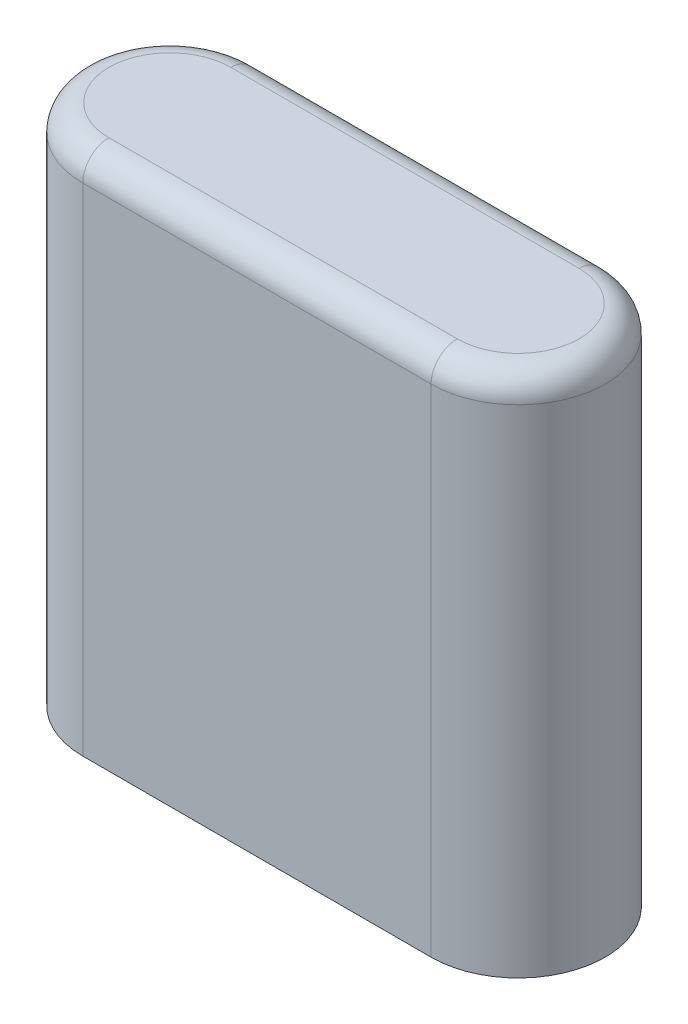
ISO-10303-21;
HEADER;
FILE_DESCRIPTION(('STEP AP214'),'2;1');
FILE_NAME('part.step','',(''),(''),'','','');
FILE_SCHEMA(('AUTOMOTIVE_DESIGN { 1 0 10303 214 1 1 1 1 }'));
ENDSEC;
DATA;
#1=APPLICATION_CONTEXT('core data for automotive mechanical design processes');
#2=APPLICATION_PROTOCOL_DEFINITION('international standard','automotive_design',2000,#1);
#3=PRODUCT_CONTEXT('',#1,'mechanical');
#4=PRODUCT('Part','Part','',(#3));
#5=PRODUCT_RELATED_PRODUCT_CATEGORY('part','',(#4));
#6=PRODUCT_DEFINITION_FORMATION('','',#4);
#7=PRODUCT_DEFINITION_CONTEXT('part definition',#1,'design');
#8=PRODUCT_DEFINITION('design','',#6,#7);
#9=PRODUCT_DEFINITION_SHAPE('','',#8);
#10=(LENGTH_UNIT() NAMED_UNIT(*) SI_UNIT(.MILLI.,.METRE.));
#11=(NAMED_UNIT(*) PLANE_ANGLE_UNIT() SI_UNIT($,.RADIAN.));
#12=(NAMED_UNIT(*) SI_UNIT($,.STERADIAN.) SOLID_ANGLE_UNIT());
#13=UNCERTAINTY_MEASURE_WITH_UNIT(LENGTH_MEASURE(1.E-05),#10,'distance_accuracy_value','');
#14=(GEOMETRIC_REPRESENTATION_CONTEXT(3) GLOBAL_UNCERTAINTY_ASSIGNED_CONTEXT((#13)) GLOBAL_UNIT_ASSIGNED_CONTEXT((#10,
#11,#12)) REPRESENTATION_CONTEXT('',''));
#15=CARTESIAN_POINT('',(0.,0.,0.));
#16=DIRECTION('',(0.,0.,1.));
#17=DIRECTION('',(1.,0.,0.));
#18=AXIS2_PLACEMENT_3D('',#15,#16,#17);
#19=CARTESIAN_POINT('',(-20.,30.,0.));
#20=DIRECTION('',(0.,-1.,0.));
#21=DIRECTION('',(0.,0.,-1.));
#22=AXIS2_PLACEMENT_3D('',#19,#20,#21);
#23=CYLINDRICAL_SURFACE('',#22,10.);
#24=DIRECTION('',(0.,-1.,0.));
#25=VECTOR('',#24,1.);
#26=CARTESIAN_POINT('',(-20.,30.,10.));
#27=LINE('',#26,#25);
#28=CARTESIAN_POINT('',(-20.,27.,10.));
#29=VERTEX_POINT('',#28);
#30=CARTESIAN_POINT('',(-20.,-30.,10.));
#31=VERTEX_POINT('',#30);
#32=EDGE_CURVE('E86',#29,#31,#27,.T.);
#33=ORIENTED_EDGE('',*,*,#32,.F.);
#34=CARTESIAN_POINT('',(-20.,27.,0.));
#35=DIRECTION('',(0.,1.,0.));
#36=DIRECTION('',(0.,0.,1.));
#37=AXIS2_PLACEMENT_3D('',#34,#35,#36);
#38=CIRCLE('',#37,10.);
#39=CARTESIAN_POINT('',(-20.,27.,-10.));
#40=VERTEX_POINT('',#39);
#41=EDGE_CURVE('E137',#29,#40,#38,.F.);
#42=ORIENTED_EDGE('',*,*,#41,.T.);
#43=DIRECTION('',(0.,-1.,0.));
#44=VECTOR('',#43,1.);
#45=CARTESIAN_POINT('',(-20.,30.,-10.));
#46=LINE('',#45,#44);
#47=CARTESIAN_POINT('',(-20.,-30.,-10.));
#48=VERTEX_POINT('',#47);
#49=EDGE_CURVE('E106',#40,#48,#46,.T.);
#50=ORIENTED_EDGE('',*,*,#49,.T.);
#51=CARTESIAN_POINT('',(-20.,-30.,0.));
#52=DIRECTION('',(0.,1.,0.));
#53=DIRECTION('',(0.,0.,1.));
#54=AXIS2_PLACEMENT_3D('',#51,#52,#53);
#55=CIRCLE('',#54,10.);
#56=EDGE_CURVE('E101',#48,#31,#55,.T.);
#57=ORIENTED_EDGE('',*,*,#56,.T.);
#58=EDGE_LOOP('',(#33,#42,#50,#57));
#59=FACE_BOUND('',#58,.T.);
#60=ADVANCED_FACE('F34',(#59),#23,.T.);
#61=CARTESIAN_POINT('',(-20.,30.,10.));
#62=DIRECTION('',(0.,0.,-1.));
#63=DIRECTION('',(-1.,0.,0.));
#64=AXIS2_PLACEMENT_3D('',#61,#62,#63);
#65=PLANE('',#64);
#66=DIRECTION('',(0.,-1.,0.));
#67=VECTOR('',#66,1.);
#68=CARTESIAN_POINT('',(20.,30.,9.99999999999999));
#69=LINE('',#68,#67);
#70=CARTESIAN_POINT('',(20.,27.,9.99999999999999));
#71=VERTEX_POINT('',#70);
#72=CARTESIAN_POINT('',(20.,-30.,9.99999999999999));
#73=VERTEX_POINT('',#72);
#74=EDGE_CURVE('E95',#71,#73,#69,.T.);
#75=ORIENTED_EDGE('',*,*,#74,.F.);
#76=DIRECTION('',(1.,0.,0.));
#77=VECTOR('',#76,1.);
#78=CARTESIAN_POINT('',(-20.,27.,10.));
#79=LINE('',#78,#77);
#80=EDGE_CURVE('E49',#71,#29,#79,.F.);
#81=ORIENTED_EDGE('',*,*,#80,.T.);
#82=ORIENTED_EDGE('',*,*,#32,.T.);
#83=DIRECTION('',(1.,0.,0.));
#84=VECTOR('',#83,1.);
#85=CARTESIAN_POINT('',(-20.,-30.,10.));
#86=LINE('',#85,#84);
#87=EDGE_CURVE('E89',#31,#73,#86,.T.);
#88=ORIENTED_EDGE('',*,*,#87,.T.);
#89=EDGE_LOOP('',(#75,#81,#82,#88));
#90=FACE_BOUND('',#89,.T.);
#91=ADVANCED_FACE('F88',(#90),#65,.F.);
#92=CARTESIAN_POINT('',(20.,30.,0.));
#93=DIRECTION('',(0.,-1.,0.));
#94=DIRECTION('',(0.,0.,-1.));
#95=AXIS2_PLACEMENT_3D('',#92,#93,#94);
#96=CYLINDRICAL_SURFACE('',#95,10.);
#97=DIRECTION('',(0.,-1.,0.));
#98=VECTOR('',#97,1.);
#99=CARTESIAN_POINT('',(20.,30.,-10.));
#100=LINE('',#99,#98);
#101=CARTESIAN_POINT('',(20.,27.,-10.));
#102=VERTEX_POINT('',#101);
#103=CARTESIAN_POINT('',(20.,-30.,-10.));
#104=VERTEX_POINT('',#103);
#105=EDGE_CURVE('E121',#102,#104,#100,.T.);
#106=ORIENTED_EDGE('',*,*,#105,.F.);
#107=CARTESIAN_POINT('',(20.,27.,0.));
#108=DIRECTION('',(0.,1.,0.));
#109=DIRECTION('',(0.,0.,1.));
#110=AXIS2_PLACEMENT_3D('',#107,#108,#109);
#111=CIRCLE('',#110,10.);
#112=EDGE_CURVE('E57',#102,#71,#111,.F.);
#113=ORIENTED_EDGE('',*,*,#112,.T.);
#114=ORIENTED_EDGE('',*,*,#74,.T.);
#115=CARTESIAN_POINT('',(20.,-30.,0.));
#116=DIRECTION('',(0.,1.,0.));
#117=DIRECTION('',(0.,0.,1.));
#118=AXIS2_PLACEMENT_3D('',#115,#116,#117);
#119=CIRCLE('',#118,10.);
#120=EDGE_CURVE('E103',#73,#104,#119,.T.);
#121=ORIENTED_EDGE('',*,*,#120,.T.);
#122=EDGE_LOOP('',(#106,#113,#114,#121));
#123=FACE_BOUND('',#122,.T.);
#124=ADVANCED_FACE('F173',(#123),#96,.T.);
#125=CARTESIAN_POINT('',(-20.,30.,-10.));
#126=DIRECTION('',(0.,0.,1.));
#127=DIRECTION('',(1.,0.,0.));
#128=AXIS2_PLACEMENT_3D('',#125,#126,#127);
#129=PLANE('',#128);
#130=ORIENTED_EDGE('',*,*,#49,.F.);
#131=DIRECTION('',(-1.,0.,0.));
#132=VECTOR('',#131,1.);
#133=CARTESIAN_POINT('',(20.,27.,-10.));
#134=LINE('',#133,#132);
#135=EDGE_CURVE('E132',#40,#102,#134,.F.);
#136=ORIENTED_EDGE('',*,*,#135,.T.);
#137=ORIENTED_EDGE('',*,*,#105,.T.);
#138=DIRECTION('',(-1.,0.,0.));
#139=VECTOR('',#138,1.);
#140=CARTESIAN_POINT('',(-20.,-30.,-10.));
#141=LINE('',#140,#139);
#142=EDGE_CURVE('E118',#104,#48,#141,.T.);
#143=ORIENTED_EDGE('',*,*,#142,.T.);
#144=EDGE_LOOP('',(#130,#136,#137,#143));
#145=FACE_BOUND('',#144,.T.);
#146=ADVANCED_FACE('F160',(#145),#129,.F.);
#147=CARTESIAN_POINT('',(-20.,30.,0.));
#148=DIRECTION('',(0.,1.,0.));
#149=DIRECTION('',(0.,0.,1.));
#150=AXIS2_PLACEMENT_3D('',#147,#148,#149);
#151=PLANE('',#150);
#152=CARTESIAN_POINT('',(20.,30.,0.));
#153=DIRECTION('',(0.,1.,0.));
#154=DIRECTION('',(0.,0.,1.));
#155=AXIS2_PLACEMENT_3D('',#152,#153,#154);
#156=CIRCLE('',#155,7.);
#157=CARTESIAN_POINT('',(20.,30.,6.99999999999999));
#158=VERTEX_POINT('',#157);
#159=CARTESIAN_POINT('',(20.,30.,-7.00000000000001));
#160=VERTEX_POINT('',#159);
#161=EDGE_CURVE('E127',#158,#160,#156,.T.);
#162=ORIENTED_EDGE('',*,*,#161,.T.);
#163=DIRECTION('',(-1.,0.,0.));
#164=VECTOR('',#163,1.);
#165=CARTESIAN_POINT('',(-20.,30.,-7.));
#166=LINE('',#165,#164);
#167=CARTESIAN_POINT('',(-20.,30.,-7.));
#168=VERTEX_POINT('',#167);
#169=EDGE_CURVE('E129',#160,#168,#166,.T.);
#170=ORIENTED_EDGE('',*,*,#169,.T.);
#171=CARTESIAN_POINT('',(-20.,30.,0.));
#172=DIRECTION('',(0.,1.,0.));
#173=DIRECTION('',(0.,0.,1.));
#174=AXIS2_PLACEMENT_3D('',#171,#172,#173);
#175=CIRCLE('',#174,7.);
#176=CARTESIAN_POINT('',(-20.,30.,7.));
#177=VERTEX_POINT('',#176);
#178=EDGE_CURVE('E94',#168,#177,#175,.T.);
#179=ORIENTED_EDGE('',*,*,#178,.T.);
#180=DIRECTION('',(1.,0.,0.));
#181=VECTOR('',#180,1.);
#182=CARTESIAN_POINT('',(20.,30.,6.99999999999999));
#183=LINE('',#182,#181);
#184=EDGE_CURVE('E125',#177,#158,#183,.T.);
#185=ORIENTED_EDGE('',*,*,#184,.T.);
#186=EDGE_LOOP('',(#162,#170,#179,#185));
#187=FACE_BOUND('',#186,.T.);
#188=ADVANCED_FACE('F150',(#187),#151,.T.);
#189=CARTESIAN_POINT('',(-20.,-30.,0.));
#190=DIRECTION('',(0.,1.,0.));
#191=DIRECTION('',(0.,0.,1.));
#192=AXIS2_PLACEMENT_3D('',#189,#190,#191);
#193=PLANE('',#192);
#194=CARTESIAN_POINT('',(20.,-30.,0.));
#195=DIRECTION('',(0.,1.,0.));
#196=DIRECTION('',(0.,0.,1.));
#197=AXIS2_PLACEMENT_3D('',#194,#195,#196);
#198=CIRCLE('',#197,4.5);
#199=CARTESIAN_POINT('',(20.,-30.,4.5));
#200=VERTEX_POINT('',#199);
#201=EDGE_CURVE('E11',#200,#200,#198,.F.);
#202=ORIENTED_EDGE('',*,*,#201,.F.);
#203=EDGE_LOOP('',(#202));
#204=FACE_BOUND('',#203,.T.);
#205=CARTESIAN_POINT('',(-20.,-30.,0.));
#206=DIRECTION('',(0.,1.,0.));
#207=DIRECTION('',(0.,0.,1.));
#208=AXIS2_PLACEMENT_3D('',#205,#206,#207);
#209=CIRCLE('',#208,3.);
#210=CARTESIAN_POINT('',(-20.,-30.,3.));
#211=VERTEX_POINT('',#210);
#212=EDGE_CURVE('E42',#211,#211,#209,.F.);
#213=ORIENTED_EDGE('',*,*,#212,.F.);
#214=EDGE_LOOP('',(#213));
#215=FACE_BOUND('',#214,.T.);
#216=ORIENTED_EDGE('',*,*,#56,.F.);
#217=ORIENTED_EDGE('',*,*,#142,.F.);
#218=ORIENTED_EDGE('',*,*,#120,.F.);
#219=ORIENTED_EDGE('',*,*,#87,.F.);
#220=EDGE_LOOP('',(#216,#217,#218,#219));
#221=FACE_BOUND('',#220,.T.);
#222=ADVANCED_FACE('F99',(#204,#215,#221),#193,.F.);
#223=CARTESIAN_POINT('',(-20.,27.,7.));
#224=DIRECTION('',(-1.,0.,0.));
#225=DIRECTION('',(0.,0.,1.));
#226=AXIS2_PLACEMENT_3D('',#223,#224,#225);
#227=CYLINDRICAL_SURFACE('',#226,3.);
#228=CARTESIAN_POINT('',(-20.,27.,7.));
#229=DIRECTION('',(-1.,0.,0.));
#230=DIRECTION('',(0.,0.,1.));
#231=AXIS2_PLACEMENT_3D('',#228,#229,#230);
#232=CIRCLE('',#231,3.);
#233=EDGE_CURVE('E111',#29,#177,#232,.T.);
#234=ORIENTED_EDGE('',*,*,#233,.F.);
#235=ORIENTED_EDGE('',*,*,#80,.F.);
#236=CARTESIAN_POINT('',(20.,27.,6.99999999999999));
#237=DIRECTION('',(1.,0.,0.));
#238=DIRECTION('',(0.,0.,-1.));
#239=AXIS2_PLACEMENT_3D('',#236,#237,#238);
#240=CIRCLE('',#239,3.);
#241=EDGE_CURVE('E108',#158,#71,#240,.T.);
#242=ORIENTED_EDGE('',*,*,#241,.F.);
#243=ORIENTED_EDGE('',*,*,#184,.F.);
#244=EDGE_LOOP('',(#234,#235,#242,#243));
#245=FACE_BOUND('',#244,.T.);
#246=ADVANCED_FACE('F36',(#245),#227,.T.);
#247=CARTESIAN_POINT('',(20.,27.,0.));
#248=DIRECTION('',(0.,1.,0.));
#249=DIRECTION('',(0.,0.,1.));
#250=AXIS2_PLACEMENT_3D('',#247,#248,#249);
#251=TOROIDAL_SURFACE('',#250,7.,3.);
#252=ORIENTED_EDGE('',*,*,#241,.T.);
#253=ORIENTED_EDGE('',*,*,#112,.F.);
#254=CARTESIAN_POINT('',(20.,27.,-7.00000000000001));
#255=DIRECTION('',(-1.,0.,0.));
#256=DIRECTION('',(0.,0.,1.));
#257=AXIS2_PLACEMENT_3D('',#254,#255,#256);
#258=CIRCLE('',#257,3.);
#259=EDGE_CURVE('E141',#160,#102,#258,.T.);
#260=ORIENTED_EDGE('',*,*,#259,.F.);
#261=ORIENTED_EDGE('',*,*,#161,.F.);
#262=EDGE_LOOP('',(#252,#253,#260,#261));
#263=FACE_BOUND('',#262,.T.);
#264=ADVANCED_FACE('F158',(#263),#251,.T.);
#265=CARTESIAN_POINT('',(-20.,27.,0.));
#266=DIRECTION('',(0.,1.,0.));
#267=DIRECTION('',(0.,0.,1.));
#268=AXIS2_PLACEMENT_3D('',#265,#266,#267);
#269=TOROIDAL_SURFACE('',#268,7.,3.);
#270=ORIENTED_EDGE('',*,*,#233,.T.);
#271=ORIENTED_EDGE('',*,*,#178,.F.);
#272=CARTESIAN_POINT('',(-20.,27.,-7.));
#273=DIRECTION('',(1.,0.,0.));
#274=DIRECTION('',(0.,0.,-1.));
#275=AXIS2_PLACEMENT_3D('',#272,#273,#274);
#276=CIRCLE('',#275,3.);
#277=EDGE_CURVE('E139',#40,#168,#276,.T.);
#278=ORIENTED_EDGE('',*,*,#277,.F.);
#279=ORIENTED_EDGE('',*,*,#41,.F.);
#280=EDGE_LOOP('',(#270,#271,#278,#279));
#281=FACE_BOUND('',#280,.T.);
#282=ADVANCED_FACE('F180',(#281),#269,.T.);
#283=CARTESIAN_POINT('',(-20.,27.,-7.));
#284=DIRECTION('',(1.,0.,0.));
#285=DIRECTION('',(0.,0.,-1.));
#286=AXIS2_PLACEMENT_3D('',#283,#284,#285);
#287=CYLINDRICAL_SURFACE('',#286,3.);
#288=ORIENTED_EDGE('',*,*,#259,.T.);
#289=ORIENTED_EDGE('',*,*,#135,.F.);
#290=ORIENTED_EDGE('',*,*,#277,.T.);
#291=ORIENTED_EDGE('',*,*,#169,.F.);
#292=EDGE_LOOP('',(#288,#289,#290,#291));
#293=FACE_BOUND('',#292,.T.);
#294=ADVANCED_FACE('F177',(#293),#287,.T.);
#295=CARTESIAN_POINT('',(-20.,-33.,0.));
#296=DIRECTION('',(0.,1.,0.));
#297=DIRECTION('',(0.,0.,1.));
#298=AXIS2_PLACEMENT_3D('',#295,#296,#297);
#299=CYLINDRICAL_SURFACE('',#298,3.);
#300=CARTESIAN_POINT('',(-20.,-33.,0.));
#301=DIRECTION('',(0.,-1.,0.));
#302=DIRECTION('',(0.,0.,-1.));
#303=AXIS2_PLACEMENT_3D('',#300,#301,#302);
#304=CIRCLE('',#303,3.);
#305=CARTESIAN_POINT('',(-20.,-33.,-3.));
#306=VERTEX_POINT('',#305);
#307=EDGE_CURVE('E114',#306,#306,#304,.T.);
#308=ORIENTED_EDGE('',*,*,#307,.F.);
#309=EDGE_LOOP('',(#308));
#310=FACE_BOUND('',#309,.T.);
#311=ORIENTED_EDGE('',*,*,#212,.T.);
#312=EDGE_LOOP('',(#311));
#313=FACE_BOUND('',#312,.T.);
#314=ADVANCED_FACE('F147',(#310,#313),#299,.T.);
#315=CARTESIAN_POINT('',(-20.,-33.,0.));
#316=DIRECTION('',(0.,-1.,0.));
#317=DIRECTION('',(0.,0.,-1.));
#318=AXIS2_PLACEMENT_3D('',#315,#316,#317);
#319=PLANE('',#318);
#320=ORIENTED_EDGE('',*,*,#307,.T.);
#321=EDGE_LOOP('',(#320));
#322=FACE_BOUND('',#321,.T.);
#323=ADVANCED_FACE('F244',(#322),#319,.T.);
#324=CARTESIAN_POINT('',(20.,-33.,0.));
#325=DIRECTION('',(0.,-1.,0.));
#326=DIRECTION('',(0.,0.,-1.));
#327=AXIS2_PLACEMENT_3D('',#324,#325,#326);
#328=PLANE('',#327);
#329=CARTESIAN_POINT('',(20.,-33.,0.));
#330=DIRECTION('',(0.,-1.,0.));
#331=DIRECTION('',(0.,0.,-1.));
#332=AXIS2_PLACEMENT_3D('',#329,#330,#331);
#333=CIRCLE('',#332,4.5);
#334=CARTESIAN_POINT('',(20.,-33.,-4.5));
#335=VERTEX_POINT('',#334);
#336=EDGE_CURVE('E300',#335,#335,#333,.T.);
#337=ORIENTED_EDGE('',*,*,#336,.T.);
#338=EDGE_LOOP('',(#337));
#339=FACE_BOUND('',#338,.T.);
#340=CARTESIAN_POINT('',(20.,-33.,0.));
#341=DIRECTION('',(0.,-1.,0.));
#342=DIRECTION('',(0.,0.,-1.));
#343=AXIS2_PLACEMENT_3D('',#340,#341,#342);
#344=CIRCLE('',#343,3.);
#345=CARTESIAN_POINT('',(20.,-33.,-3.));
#346=VERTEX_POINT('',#345);
#347=EDGE_CURVE('E295',#346,#346,#344,.T.);
#348=ORIENTED_EDGE('',*,*,#347,.F.);
#349=EDGE_LOOP('',(#348));
#350=FACE_BOUND('',#349,.T.);
#351=ADVANCED_FACE('F254',(#339,#350),#328,.T.);
#352=CARTESIAN_POINT('',(20.,-33.,0.));
#353=DIRECTION('',(0.,1.,0.));
#354=DIRECTION('',(0.,0.,1.));
#355=AXIS2_PLACEMENT_3D('',#352,#353,#354);
#356=CYLINDRICAL_SURFACE('',#355,4.5);
#357=ORIENTED_EDGE('',*,*,#336,.F.);
#358=EDGE_LOOP('',(#357));
#359=FACE_BOUND('',#358,.T.);
#360=ORIENTED_EDGE('',*,*,#201,.T.);
#361=EDGE_LOOP('',(#360));
#362=FACE_BOUND('',#361,.T.);
#363=ADVANCED_FACE('F264',(#359,#362),#356,.T.);
#364=CARTESIAN_POINT('',(20.,-33.,0.));
#365=DIRECTION('',(0.,1.,0.));
#366=DIRECTION('',(0.,0.,1.));
#367=AXIS2_PLACEMENT_3D('',#364,#365,#366);
#368=CYLINDRICAL_SURFACE('',#367,3.);
#369=ORIENTED_EDGE('',*,*,#347,.T.);
#370=EDGE_LOOP('',(#369));
#371=FACE_BOUND('',#370,.T.);
#372=CARTESIAN_POINT('',(20.,-30.,0.));
#373=DIRECTION('',(0.,-1.,0.));
#374=DIRECTION('',(0.,0.,-1.));
#375=AXIS2_PLACEMENT_3D('',#372,#373,#374);
#376=CIRCLE('',#375,3.);
#377=CARTESIAN_POINT('',(20.,-30.,-3.));
#378=VERTEX_POINT('',#377);
#379=EDGE_CURVE('E298',#378,#378,#376,.T.);
#380=ORIENTED_EDGE('',*,*,#379,.F.);
#381=EDGE_LOOP('',(#380));
#382=FACE_BOUND('',#381,.T.);
#383=ADVANCED_FACE('F166',(#371,#382),#368,.F.);
#384=ORIENTED_EDGE('',*,*,#379,.T.);
#385=EDGE_LOOP('',(#384));
#386=FACE_BOUND('',#385,.T.);
#387=ADVANCED_FACE('F153',(#386),#193,.F.);
#388=CLOSED_SHELL('',(#60,#91,#124,#146,#188,#222,#246,#264,#282,#294,#314,#323,#351,#363,#383,#387));
#389=MANIFOLD_SOLID_BREP('B2',#388);
#390=ADVANCED_BREP_SHAPE_REPRESENTATION('',(#18,#389),#14);
#391=SHAPE_DEFINITION_REPRESENTATION(#9,#390);
ENDSEC;
END-ISO-10303-21;
